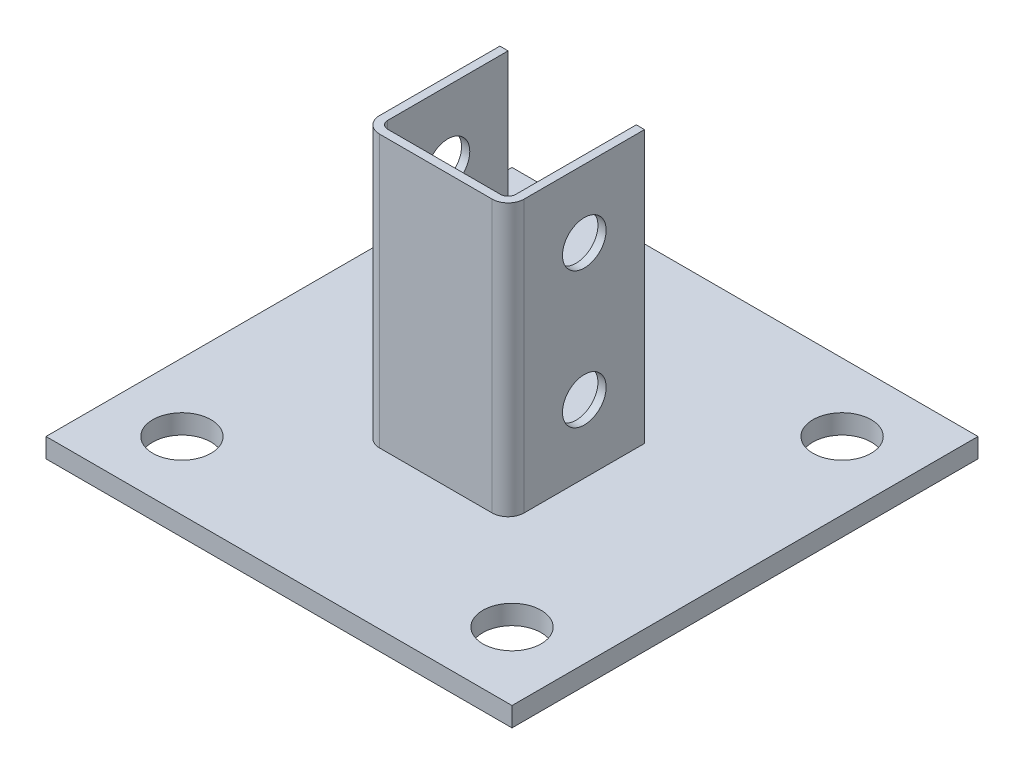
ISO-10303-21;
HEADER;
FILE_DESCRIPTION(('STEP AP214'),'2;1');
FILE_NAME('part.step','',(''),(''),'','','');
FILE_SCHEMA(('AUTOMOTIVE_DESIGN { 1 0 10303 214 1 1 1 1 }'));
ENDSEC;
DATA;
#1=APPLICATION_CONTEXT('core data for automotive mechanical design processes');
#2=APPLICATION_PROTOCOL_DEFINITION('international standard','automotive_design',2000,#1);
#3=PRODUCT_CONTEXT('',#1,'mechanical');
#4=PRODUCT('Part','Part','',(#3));
#5=PRODUCT_RELATED_PRODUCT_CATEGORY('part','',(#4));
#6=PRODUCT_DEFINITION_FORMATION('','',#4);
#7=PRODUCT_DEFINITION_CONTEXT('part definition',#1,'design');
#8=PRODUCT_DEFINITION('design','',#6,#7);
#9=PRODUCT_DEFINITION_SHAPE('','',#8);
#10=(LENGTH_UNIT() NAMED_UNIT(*) SI_UNIT(.MILLI.,.METRE.));
#11=(NAMED_UNIT(*) PLANE_ANGLE_UNIT() SI_UNIT($,.RADIAN.));
#12=(NAMED_UNIT(*) SI_UNIT($,.STERADIAN.) SOLID_ANGLE_UNIT());
#13=UNCERTAINTY_MEASURE_WITH_UNIT(LENGTH_MEASURE(1.E-05),#10,'distance_accuracy_value','');
#14=(GEOMETRIC_REPRESENTATION_CONTEXT(3) GLOBAL_UNCERTAINTY_ASSIGNED_CONTEXT((#13)) GLOBAL_UNIT_ASSIGNED_CONTEXT((#10,
#11,#12)) REPRESENTATION_CONTEXT('',''));
#15=CARTESIAN_POINT('',(0.,0.,0.));
#16=DIRECTION('',(0.,0.,1.));
#17=DIRECTION('',(1.,0.,0.));
#18=AXIS2_PLACEMENT_3D('',#15,#16,#17);
#19=CARTESIAN_POINT('',(-76.2,6.35,-76.2));
#20=DIRECTION('',(0.,1.,0.));
#21=DIRECTION('',(0.,0.,1.));
#22=AXIS2_PLACEMENT_3D('',#19,#20,#21);
#23=PLANE('',#22);
#24=DIRECTION('',(0.,0.,1.));
#25=VECTOR('',#24,1.);
#26=CARTESIAN_POINT('',(-76.2,6.35,76.2));
#27=LINE('',#26,#25);
#28=CARTESIAN_POINT('',(-76.2,6.35,-76.2));
#29=VERTEX_POINT('',#28);
#30=CARTESIAN_POINT('',(-76.2,6.35,76.2));
#31=VERTEX_POINT('',#30);
#32=EDGE_CURVE('E281',#29,#31,#27,.T.);
#33=ORIENTED_EDGE('',*,*,#32,.T.);
#34=DIRECTION('',(1.,0.,0.));
#35=VECTOR('',#34,1.);
#36=CARTESIAN_POINT('',(76.2,6.35,76.2));
#37=LINE('',#36,#35);
#38=CARTESIAN_POINT('',(76.2,6.35,76.2));
#39=VERTEX_POINT('',#38);
#40=EDGE_CURVE('E87',#31,#39,#37,.T.);
#41=ORIENTED_EDGE('',*,*,#40,.T.);
#42=DIRECTION('',(0.,0.,-1.));
#43=VECTOR('',#42,1.);
#44=CARTESIAN_POINT('',(76.2,6.35,76.2));
#45=LINE('',#44,#43);
#46=CARTESIAN_POINT('',(76.2,6.35,-76.2));
#47=VERTEX_POINT('',#46);
#48=EDGE_CURVE('E284',#39,#47,#45,.T.);
#49=ORIENTED_EDGE('',*,*,#48,.T.);
#50=DIRECTION('',(-1.,0.,0.));
#51=VECTOR('',#50,1.);
#52=CARTESIAN_POINT('',(76.2,6.35,-76.2));
#53=LINE('',#52,#51);
#54=EDGE_CURVE('E59',#47,#29,#53,.T.);
#55=ORIENTED_EDGE('',*,*,#54,.T.);
#56=EDGE_LOOP('',(#33,#41,#49,#55));
#57=FACE_BOUND('',#56,.T.);
#58=CARTESIAN_POINT('',(-53.975,6.35,53.975));
#59=DIRECTION('',(0.,1.,0.));
#60=DIRECTION('',(0.,0.,1.));
#61=AXIS2_PLACEMENT_3D('',#58,#59,#60);
#62=CIRCLE('',#61,9.52499999999998);
#63=CARTESIAN_POINT('',(-53.975,6.35,63.5));
#64=VERTEX_POINT('',#63);
#65=EDGE_CURVE('E274',#64,#64,#62,.T.);
#66=ORIENTED_EDGE('',*,*,#65,.F.);
#67=EDGE_LOOP('',(#66));
#68=FACE_BOUND('',#67,.T.);
#69=CARTESIAN_POINT('',(53.975,6.35,53.975));
#70=DIRECTION('',(0.,1.,0.));
#71=DIRECTION('',(0.,0.,1.));
#72=AXIS2_PLACEMENT_3D('',#69,#70,#71);
#73=CIRCLE('',#72,9.52499999999998);
#74=CARTESIAN_POINT('',(53.975,6.35,63.5));
#75=VERTEX_POINT('',#74);
#76=EDGE_CURVE('E270',#75,#75,#73,.T.);
#77=ORIENTED_EDGE('',*,*,#76,.F.);
#78=EDGE_LOOP('',(#77));
#79=FACE_BOUND('',#78,.T.);
#80=CARTESIAN_POINT('',(53.975,6.35,-53.9750000000001));
#81=DIRECTION('',(0.,1.,0.));
#82=DIRECTION('',(0.,0.,1.));
#83=AXIS2_PLACEMENT_3D('',#80,#81,#82);
#84=CIRCLE('',#83,9.52499999999998);
#85=CARTESIAN_POINT('',(53.975,6.35,-44.4500000000001));
#86=VERTEX_POINT('',#85);
#87=EDGE_CURVE('E264',#86,#86,#84,.T.);
#88=ORIENTED_EDGE('',*,*,#87,.F.);
#89=EDGE_LOOP('',(#88));
#90=FACE_BOUND('',#89,.T.);
#91=CARTESIAN_POINT('',(-53.975,6.35,-53.975));
#92=DIRECTION('',(0.,1.,0.));
#93=DIRECTION('',(0.,0.,1.));
#94=AXIS2_PLACEMENT_3D('',#91,#92,#93);
#95=CIRCLE('',#94,9.52499999999998);
#96=CARTESIAN_POINT('',(-53.975,6.35,-44.4500000000001));
#97=VERTEX_POINT('',#96);
#98=EDGE_CURVE('E179',#97,#97,#95,.T.);
#99=ORIENTED_EDGE('',*,*,#98,.F.);
#100=EDGE_LOOP('',(#99));
#101=FACE_BOUND('',#100,.T.);
#102=DIRECTION('',(1.,0.,0.));
#103=VECTOR('',#102,1.);
#104=CARTESIAN_POINT('',(20.955,6.35,-19.685));
#105=LINE('',#104,#103);
#106=CARTESIAN_POINT('',(20.955,6.35,-19.685));
#107=VERTEX_POINT('',#106);
#108=CARTESIAN_POINT('',(23.6474,6.35,-19.685));
#109=VERTEX_POINT('',#108);
#110=EDGE_CURVE('E212',#107,#109,#105,.T.);
#111=ORIENTED_EDGE('',*,*,#110,.T.);
#112=DIRECTION('',(0.,0.,-1.));
#113=VECTOR('',#112,1.);
#114=CARTESIAN_POINT('',(23.6474,6.35,19.685));
#115=LINE('',#114,#113);
#116=CARTESIAN_POINT('',(23.6474,6.35,19.685));
#117=VERTEX_POINT('',#116);
#118=EDGE_CURVE('E175',#117,#109,#115,.T.);
#119=ORIENTED_EDGE('',*,*,#118,.F.);
#120=CARTESIAN_POINT('',(18.415,6.35,19.685));
#121=DIRECTION('',(0.,1.,0.));
#122=DIRECTION('',(1.,0.,0.));
#123=AXIS2_PLACEMENT_3D('',#120,#121,#122);
#124=CIRCLE('',#123,5.2324);
#125=CARTESIAN_POINT('',(18.415,6.34999999999999,24.9174));
#126=VERTEX_POINT('',#125);
#127=EDGE_CURVE('E169',#126,#117,#124,.T.);
#128=ORIENTED_EDGE('',*,*,#127,.F.);
#129=DIRECTION('',(1.,0.,0.));
#130=VECTOR('',#129,1.);
#131=CARTESIAN_POINT('',(-18.415,6.35,24.9174));
#132=LINE('',#131,#130);
#133=CARTESIAN_POINT('',(-18.415,6.35,24.9174));
#134=VERTEX_POINT('',#133);
#135=EDGE_CURVE('E237',#134,#126,#132,.T.);
#136=ORIENTED_EDGE('',*,*,#135,.F.);
#137=CARTESIAN_POINT('',(-18.415,6.35,19.685));
#138=DIRECTION('',(0.,1.,0.));
#139=DIRECTION('',(1.,0.,0.));
#140=AXIS2_PLACEMENT_3D('',#137,#138,#139);
#141=CIRCLE('',#140,5.2324);
#142=CARTESIAN_POINT('',(-23.6474,6.35,19.685));
#143=VERTEX_POINT('',#142);
#144=EDGE_CURVE('E235',#143,#134,#141,.T.);
#145=ORIENTED_EDGE('',*,*,#144,.F.);
#146=DIRECTION('',(0.,0.,1.));
#147=VECTOR('',#146,1.);
#148=CARTESIAN_POINT('',(-23.6474,6.35,-19.685));
#149=LINE('',#148,#147);
#150=CARTESIAN_POINT('',(-23.6474,6.35,-19.685));
#151=VERTEX_POINT('',#150);
#152=EDGE_CURVE('E233',#151,#143,#149,.T.);
#153=ORIENTED_EDGE('',*,*,#152,.F.);
#154=DIRECTION('',(1.,0.,0.));
#155=VECTOR('',#154,1.);
#156=CARTESIAN_POINT('',(-23.6474,6.35,-19.685));
#157=LINE('',#156,#155);
#158=CARTESIAN_POINT('',(-20.955,6.35,-19.685));
#159=VERTEX_POINT('',#158);
#160=EDGE_CURVE('E230',#151,#159,#157,.T.);
#161=ORIENTED_EDGE('',*,*,#160,.T.);
#162=DIRECTION('',(0.,0.,1.));
#163=VECTOR('',#162,1.);
#164=CARTESIAN_POINT('',(-20.955,6.35,-19.685));
#165=LINE('',#164,#163);
#166=CARTESIAN_POINT('',(-20.955,6.35,19.685));
#167=VERTEX_POINT('',#166);
#168=EDGE_CURVE('E227',#159,#167,#165,.T.);
#169=ORIENTED_EDGE('',*,*,#168,.T.);
#170=CARTESIAN_POINT('',(-18.415,6.35,19.685));
#171=DIRECTION('',(0.,1.,0.));
#172=DIRECTION('',(0.,0.,1.));
#173=AXIS2_PLACEMENT_3D('',#170,#171,#172);
#174=CIRCLE('',#173,2.54);
#175=CARTESIAN_POINT('',(-18.415,6.35,22.225));
#176=VERTEX_POINT('',#175);
#177=EDGE_CURVE('E224',#167,#176,#174,.T.);
#178=ORIENTED_EDGE('',*,*,#177,.T.);
#179=DIRECTION('',(1.,0.,0.));
#180=VECTOR('',#179,1.);
#181=CARTESIAN_POINT('',(-18.415,6.35,22.225));
#182=LINE('',#181,#180);
#183=CARTESIAN_POINT('',(18.415,6.35,22.225));
#184=VERTEX_POINT('',#183);
#185=EDGE_CURVE('E221',#176,#184,#182,.T.);
#186=ORIENTED_EDGE('',*,*,#185,.T.);
#187=CARTESIAN_POINT('',(18.415,6.35,19.685));
#188=DIRECTION('',(0.,1.,0.));
#189=DIRECTION('',(0.,0.,1.));
#190=AXIS2_PLACEMENT_3D('',#187,#188,#189);
#191=CIRCLE('',#190,2.54);
#192=CARTESIAN_POINT('',(20.955,6.35,19.685));
#193=VERTEX_POINT('',#192);
#194=EDGE_CURVE('E218',#184,#193,#191,.T.);
#195=ORIENTED_EDGE('',*,*,#194,.T.);
#196=DIRECTION('',(0.,0.,-1.));
#197=VECTOR('',#196,1.);
#198=CARTESIAN_POINT('',(20.955,6.35,19.685));
#199=LINE('',#198,#197);
#200=EDGE_CURVE('E215',#193,#107,#199,.T.);
#201=ORIENTED_EDGE('',*,*,#200,.T.);
#202=EDGE_LOOP('',(#111,#119,#128,#136,#145,#153,#161,#169,#178,#186,#195,#201));
#203=FACE_BOUND('',#202,.T.);
#204=ADVANCED_FACE('F33',(#57,#68,#79,#90,#101,#203),#23,.T.);
#205=CARTESIAN_POINT('',(-76.2,6.35,76.2));
#206=DIRECTION('',(1.,0.,0.));
#207=DIRECTION('',(0.,0.,-1.));
#208=AXIS2_PLACEMENT_3D('',#205,#206,#207);
#209=PLANE('',#208);
#210=DIRECTION('',(0.,0.,1.));
#211=VECTOR('',#210,1.);
#212=CARTESIAN_POINT('',(-76.2,0.,76.2));
#213=LINE('',#212,#211);
#214=CARTESIAN_POINT('',(-76.2,0.,-76.2));
#215=VERTEX_POINT('',#214);
#216=CARTESIAN_POINT('',(-76.2,0.,76.2));
#217=VERTEX_POINT('',#216);
#218=EDGE_CURVE('E280',#215,#217,#213,.T.);
#219=ORIENTED_EDGE('',*,*,#218,.T.);
#220=DIRECTION('',(0.,-1.,0.));
#221=VECTOR('',#220,1.);
#222=CARTESIAN_POINT('',(-76.2,6.35,76.2));
#223=LINE('',#222,#221);
#224=EDGE_CURVE('E11',#31,#217,#223,.T.);
#225=ORIENTED_EDGE('',*,*,#224,.F.);
#226=ORIENTED_EDGE('',*,*,#32,.F.);
#227=DIRECTION('',(0.,-1.,0.));
#228=VECTOR('',#227,1.);
#229=CARTESIAN_POINT('',(-76.2,6.35,-76.2));
#230=LINE('',#229,#228);
#231=EDGE_CURVE('E287',#29,#215,#230,.T.);
#232=ORIENTED_EDGE('',*,*,#231,.T.);
#233=EDGE_LOOP('',(#219,#225,#226,#232));
#234=FACE_BOUND('',#233,.T.);
#235=ADVANCED_FACE('F35',(#234),#209,.F.);
#236=CARTESIAN_POINT('',(76.2,6.35,76.2));
#237=DIRECTION('',(0.,0.,-1.));
#238=DIRECTION('',(-1.,0.,0.));
#239=AXIS2_PLACEMENT_3D('',#236,#237,#238);
#240=PLANE('',#239);
#241=DIRECTION('',(1.,0.,0.));
#242=VECTOR('',#241,1.);
#243=CARTESIAN_POINT('',(76.2,0.,76.2));
#244=LINE('',#243,#242);
#245=CARTESIAN_POINT('',(76.2,0.,76.2));
#246=VERTEX_POINT('',#245);
#247=EDGE_CURVE('E290',#217,#246,#244,.T.);
#248=ORIENTED_EDGE('',*,*,#247,.T.);
#249=DIRECTION('',(0.,-1.,0.));
#250=VECTOR('',#249,1.);
#251=CARTESIAN_POINT('',(76.2,6.35,76.2));
#252=LINE('',#251,#250);
#253=EDGE_CURVE('E42',#39,#246,#252,.T.);
#254=ORIENTED_EDGE('',*,*,#253,.F.);
#255=ORIENTED_EDGE('',*,*,#40,.F.);
#256=ORIENTED_EDGE('',*,*,#224,.T.);
#257=EDGE_LOOP('',(#248,#254,#255,#256));
#258=FACE_BOUND('',#257,.T.);
#259=ADVANCED_FACE('F344',(#258),#240,.F.);
#260=CARTESIAN_POINT('',(76.2,6.35,76.2));
#261=DIRECTION('',(-1.,0.,0.));
#262=DIRECTION('',(0.,0.,1.));
#263=AXIS2_PLACEMENT_3D('',#260,#261,#262);
#264=PLANE('',#263);
#265=DIRECTION('',(0.,0.,-1.));
#266=VECTOR('',#265,1.);
#267=CARTESIAN_POINT('',(76.2,0.,76.2));
#268=LINE('',#267,#266);
#269=CARTESIAN_POINT('',(76.2,0.,-76.2));
#270=VERTEX_POINT('',#269);
#271=EDGE_CURVE('E292',#246,#270,#268,.T.);
#272=ORIENTED_EDGE('',*,*,#271,.T.);
#273=DIRECTION('',(0.,-1.,0.));
#274=VECTOR('',#273,1.);
#275=CARTESIAN_POINT('',(76.2,6.35,-76.2));
#276=LINE('',#275,#274);
#277=EDGE_CURVE('E296',#47,#270,#276,.T.);
#278=ORIENTED_EDGE('',*,*,#277,.F.);
#279=ORIENTED_EDGE('',*,*,#48,.F.);
#280=ORIENTED_EDGE('',*,*,#253,.T.);
#281=EDGE_LOOP('',(#272,#278,#279,#280));
#282=FACE_BOUND('',#281,.T.);
#283=ADVANCED_FACE('F358',(#282),#264,.F.);
#284=CARTESIAN_POINT('',(76.2,6.35,-76.2));
#285=DIRECTION('',(0.,0.,1.));
#286=DIRECTION('',(1.,0.,0.));
#287=AXIS2_PLACEMENT_3D('',#284,#285,#286);
#288=PLANE('',#287);
#289=DIRECTION('',(-1.,0.,0.));
#290=VECTOR('',#289,1.);
#291=CARTESIAN_POINT('',(76.2,0.,-76.2));
#292=LINE('',#291,#290);
#293=EDGE_CURVE('E80',#270,#215,#292,.T.);
#294=ORIENTED_EDGE('',*,*,#293,.T.);
#295=ORIENTED_EDGE('',*,*,#231,.F.);
#296=ORIENTED_EDGE('',*,*,#54,.F.);
#297=ORIENTED_EDGE('',*,*,#277,.T.);
#298=EDGE_LOOP('',(#294,#295,#296,#297));
#299=FACE_BOUND('',#298,.T.);
#300=ADVANCED_FACE('F354',(#299),#288,.F.);
#301=CARTESIAN_POINT('',(-76.2,0.,-76.2));
#302=DIRECTION('',(0.,1.,0.));
#303=DIRECTION('',(0.,0.,1.));
#304=AXIS2_PLACEMENT_3D('',#301,#302,#303);
#305=PLANE('',#304);
#306=CARTESIAN_POINT('',(-53.975,0.,-53.975));
#307=DIRECTION('',(0.,1.,0.));
#308=DIRECTION('',(0.,0.,1.));
#309=AXIS2_PLACEMENT_3D('',#306,#307,#308);
#310=CIRCLE('',#309,9.52499999999998);
#311=CARTESIAN_POINT('',(-53.975,0.,-44.4500000000001));
#312=VERTEX_POINT('',#311);
#313=EDGE_CURVE('E263',#312,#312,#310,.T.);
#314=ORIENTED_EDGE('',*,*,#313,.T.);
#315=EDGE_LOOP('',(#314));
#316=FACE_BOUND('',#315,.T.);
#317=CARTESIAN_POINT('',(53.975,0.,-53.9750000000001));
#318=DIRECTION('',(0.,1.,0.));
#319=DIRECTION('',(0.,0.,1.));
#320=AXIS2_PLACEMENT_3D('',#317,#318,#319);
#321=CIRCLE('',#320,9.52499999999998);
#322=CARTESIAN_POINT('',(53.975,0.,-44.4500000000001));
#323=VERTEX_POINT('',#322);
#324=EDGE_CURVE('E267',#323,#323,#321,.T.);
#325=ORIENTED_EDGE('',*,*,#324,.T.);
#326=EDGE_LOOP('',(#325));
#327=FACE_BOUND('',#326,.T.);
#328=CARTESIAN_POINT('',(53.975,0.,53.975));
#329=DIRECTION('',(0.,1.,0.));
#330=DIRECTION('',(0.,0.,1.));
#331=AXIS2_PLACEMENT_3D('',#328,#329,#330);
#332=CIRCLE('',#331,9.52499999999998);
#333=CARTESIAN_POINT('',(53.975,0.,63.5));
#334=VERTEX_POINT('',#333);
#335=EDGE_CURVE('E273',#334,#334,#332,.T.);
#336=ORIENTED_EDGE('',*,*,#335,.T.);
#337=EDGE_LOOP('',(#336));
#338=FACE_BOUND('',#337,.T.);
#339=CARTESIAN_POINT('',(-53.975,0.,53.975));
#340=DIRECTION('',(0.,1.,0.));
#341=DIRECTION('',(0.,0.,1.));
#342=AXIS2_PLACEMENT_3D('',#339,#340,#341);
#343=CIRCLE('',#342,9.52499999999998);
#344=CARTESIAN_POINT('',(-53.975,0.,63.5));
#345=VERTEX_POINT('',#344);
#346=EDGE_CURVE('E277',#345,#345,#343,.T.);
#347=ORIENTED_EDGE('',*,*,#346,.T.);
#348=EDGE_LOOP('',(#347));
#349=FACE_BOUND('',#348,.T.);
#350=ORIENTED_EDGE('',*,*,#218,.F.);
#351=ORIENTED_EDGE('',*,*,#293,.F.);
#352=ORIENTED_EDGE('',*,*,#271,.F.);
#353=ORIENTED_EDGE('',*,*,#247,.F.);
#354=EDGE_LOOP('',(#350,#351,#352,#353));
#355=FACE_BOUND('',#354,.T.);
#356=ADVANCED_FACE('F351',(#316,#327,#338,#349,#355),#305,.F.);
#357=CARTESIAN_POINT('',(-53.975,6.35,53.975));
#358=DIRECTION('',(0.,1.,0.));
#359=DIRECTION('',(0.,0.,1.));
#360=AXIS2_PLACEMENT_3D('',#357,#358,#359);
#361=CYLINDRICAL_SURFACE('',#360,9.52499999999998);
#362=ORIENTED_EDGE('',*,*,#65,.T.);
#363=EDGE_LOOP('',(#362));
#364=FACE_BOUND('',#363,.T.);
#365=ORIENTED_EDGE('',*,*,#346,.F.);
#366=EDGE_LOOP('',(#365));
#367=FACE_BOUND('',#366,.T.);
#368=ADVANCED_FACE('F349',(#364,#367),#361,.F.);
#369=CARTESIAN_POINT('',(53.975,6.35,53.975));
#370=DIRECTION('',(0.,1.,0.));
#371=DIRECTION('',(0.,0.,1.));
#372=AXIS2_PLACEMENT_3D('',#369,#370,#371);
#373=CYLINDRICAL_SURFACE('',#372,9.52499999999998);
#374=ORIENTED_EDGE('',*,*,#76,.T.);
#375=EDGE_LOOP('',(#374));
#376=FACE_BOUND('',#375,.T.);
#377=ORIENTED_EDGE('',*,*,#335,.F.);
#378=EDGE_LOOP('',(#377));
#379=FACE_BOUND('',#378,.T.);
#380=ADVANCED_FACE('F391',(#376,#379),#373,.F.);
#381=CARTESIAN_POINT('',(53.975,6.35,-53.9750000000001));
#382=DIRECTION('',(0.,1.,0.));
#383=DIRECTION('',(0.,0.,1.));
#384=AXIS2_PLACEMENT_3D('',#381,#382,#383);
#385=CYLINDRICAL_SURFACE('',#384,9.52499999999998);
#386=ORIENTED_EDGE('',*,*,#87,.T.);
#387=EDGE_LOOP('',(#386));
#388=FACE_BOUND('',#387,.T.);
#389=ORIENTED_EDGE('',*,*,#324,.F.);
#390=EDGE_LOOP('',(#389));
#391=FACE_BOUND('',#390,.T.);
#392=ADVANCED_FACE('F398',(#388,#391),#385,.F.);
#393=CARTESIAN_POINT('',(-53.975,6.35,-53.975));
#394=DIRECTION('',(0.,1.,0.));
#395=DIRECTION('',(0.,0.,1.));
#396=AXIS2_PLACEMENT_3D('',#393,#394,#395);
#397=CYLINDRICAL_SURFACE('',#396,9.52499999999998);
#398=ORIENTED_EDGE('',*,*,#98,.T.);
#399=EDGE_LOOP('',(#398));
#400=FACE_BOUND('',#399,.T.);
#401=ORIENTED_EDGE('',*,*,#313,.F.);
#402=EDGE_LOOP('',(#401));
#403=FACE_BOUND('',#402,.T.);
#404=ADVANCED_FACE('F405',(#400,#403),#397,.F.);
#405=CARTESIAN_POINT('',(23.6474,95.25,19.685));
#406=DIRECTION('',(-1.,0.,0.));
#407=DIRECTION('',(0.,0.,1.));
#408=AXIS2_PLACEMENT_3D('',#405,#406,#407);
#409=PLANE('',#408);
#410=CARTESIAN_POINT('',(23.6474,73.025,0.));
#411=DIRECTION('',(1.,0.,0.));
#412=DIRECTION('',(0.,0.,-1.));
#413=AXIS2_PLACEMENT_3D('',#410,#411,#412);
#414=CIRCLE('',#413,7.14374999999999);
#415=CARTESIAN_POINT('',(23.6474,73.025,-7.14374999999999));
#416=VERTEX_POINT('',#415);
#417=EDGE_CURVE('E546',#416,#416,#414,.T.);
#418=ORIENTED_EDGE('',*,*,#417,.F.);
#419=EDGE_LOOP('',(#418));
#420=FACE_BOUND('',#419,.T.);
#421=CARTESIAN_POINT('',(23.6474,28.575,0.));
#422=DIRECTION('',(1.,0.,0.));
#423=DIRECTION('',(0.,0.,-1.));
#424=AXIS2_PLACEMENT_3D('',#421,#422,#423);
#425=CIRCLE('',#424,7.14374999999999);
#426=CARTESIAN_POINT('',(23.6474,28.575,-7.14374999999999));
#427=VERTEX_POINT('',#426);
#428=EDGE_CURVE('E306',#427,#427,#425,.T.);
#429=ORIENTED_EDGE('',*,*,#428,.F.);
#430=EDGE_LOOP('',(#429));
#431=FACE_BOUND('',#430,.T.);
#432=ORIENTED_EDGE('',*,*,#118,.T.);
#433=DIRECTION('',(0.,-1.,0.));
#434=VECTOR('',#433,1.);
#435=CARTESIAN_POINT('',(23.6474,95.25,-19.685));
#436=LINE('',#435,#434);
#437=CARTESIAN_POINT('',(23.6474,95.25,-19.685));
#438=VERTEX_POINT('',#437);
#439=EDGE_CURVE('E172',#438,#109,#436,.T.);
#440=ORIENTED_EDGE('',*,*,#439,.F.);
#441=DIRECTION('',(0.,0.,-1.));
#442=VECTOR('',#441,1.);
#443=CARTESIAN_POINT('',(23.6474,95.25,19.685));
#444=LINE('',#443,#442);
#445=CARTESIAN_POINT('',(23.6474,95.25,19.685));
#446=VERTEX_POINT('',#445);
#447=EDGE_CURVE('E158',#446,#438,#444,.T.);
#448=ORIENTED_EDGE('',*,*,#447,.F.);
#449=DIRECTION('',(0.,-1.,0.));
#450=VECTOR('',#449,1.);
#451=CARTESIAN_POINT('',(23.6474,95.25,19.685));
#452=LINE('',#451,#450);
#453=EDGE_CURVE('E210',#446,#117,#452,.T.);
#454=ORIENTED_EDGE('',*,*,#453,.T.);
#455=EDGE_LOOP('',(#432,#440,#448,#454));
#456=FACE_BOUND('',#455,.T.);
#457=ADVANCED_FACE('F173',(#420,#431,#456),#409,.F.);
#458=CARTESIAN_POINT('',(20.955,95.25,-19.685));
#459=DIRECTION('',(0.,0.,-1.));
#460=DIRECTION('',(-1.,0.,0.));
#461=AXIS2_PLACEMENT_3D('',#458,#459,#460);
#462=PLANE('',#461);
#463=ORIENTED_EDGE('',*,*,#110,.F.);
#464=DIRECTION('',(0.,-1.,0.));
#465=VECTOR('',#464,1.);
#466=CARTESIAN_POINT('',(20.955,95.25,-19.685));
#467=LINE('',#466,#465);
#468=CARTESIAN_POINT('',(20.955,95.25,-19.685));
#469=VERTEX_POINT('',#468);
#470=EDGE_CURVE('E180',#469,#107,#467,.T.);
#471=ORIENTED_EDGE('',*,*,#470,.F.);
#472=DIRECTION('',(1.,0.,0.));
#473=VECTOR('',#472,1.);
#474=CARTESIAN_POINT('',(20.955,95.25,-19.685));
#475=LINE('',#474,#473);
#476=EDGE_CURVE('E163',#469,#438,#475,.T.);
#477=ORIENTED_EDGE('',*,*,#476,.T.);
#478=ORIENTED_EDGE('',*,*,#439,.T.);
#479=EDGE_LOOP('',(#463,#471,#477,#478));
#480=FACE_BOUND('',#479,.T.);
#481=ADVANCED_FACE('F182',(#480),#462,.T.);
#482=CARTESIAN_POINT('',(20.955,95.25,19.685));
#483=DIRECTION('',(-1.,0.,0.));
#484=DIRECTION('',(0.,0.,1.));
#485=AXIS2_PLACEMENT_3D('',#482,#483,#484);
#486=PLANE('',#485);
#487=CARTESIAN_POINT('',(20.955,73.025,0.));
#488=DIRECTION('',(-1.,0.,0.));
#489=DIRECTION('',(0.,0.,1.));
#490=AXIS2_PLACEMENT_3D('',#487,#488,#489);
#491=CIRCLE('',#490,7.14374999999998);
#492=CARTESIAN_POINT('',(20.955,73.025,7.14374999999999));
#493=VERTEX_POINT('',#492);
#494=EDGE_CURVE('E317',#493,#493,#491,.T.);
#495=ORIENTED_EDGE('',*,*,#494,.F.);
#496=EDGE_LOOP('',(#495));
#497=FACE_BOUND('',#496,.T.);
#498=CARTESIAN_POINT('',(20.955,28.575,0.));
#499=DIRECTION('',(-1.,0.,0.));
#500=DIRECTION('',(0.,0.,1.));
#501=AXIS2_PLACEMENT_3D('',#498,#499,#500);
#502=CIRCLE('',#501,7.14374999999998);
#503=CARTESIAN_POINT('',(20.955,28.575,7.14374999999999));
#504=VERTEX_POINT('',#503);
#505=EDGE_CURVE('E305',#504,#504,#502,.T.);
#506=ORIENTED_EDGE('',*,*,#505,.F.);
#507=EDGE_LOOP('',(#506));
#508=FACE_BOUND('',#507,.T.);
#509=ORIENTED_EDGE('',*,*,#200,.F.);
#510=DIRECTION('',(0.,-1.,0.));
#511=VECTOR('',#510,1.);
#512=CARTESIAN_POINT('',(20.955,95.25,19.685));
#513=LINE('',#512,#511);
#514=CARTESIAN_POINT('',(20.955,95.25,19.685));
#515=VERTEX_POINT('',#514);
#516=EDGE_CURVE('E258',#515,#193,#513,.T.);
#517=ORIENTED_EDGE('',*,*,#516,.F.);
#518=DIRECTION('',(0.,0.,-1.));
#519=VECTOR('',#518,1.);
#520=CARTESIAN_POINT('',(20.955,95.25,19.685));
#521=LINE('',#520,#519);
#522=EDGE_CURVE('E183',#515,#469,#521,.T.);
#523=ORIENTED_EDGE('',*,*,#522,.T.);
#524=ORIENTED_EDGE('',*,*,#470,.T.);
#525=EDGE_LOOP('',(#509,#517,#523,#524));
#526=FACE_BOUND('',#525,.T.);
#527=ADVANCED_FACE('F429',(#497,#508,#526),#486,.T.);
#528=CARTESIAN_POINT('',(18.415,95.25,19.685));
#529=DIRECTION('',(0.,-1.,0.));
#530=DIRECTION('',(0.,0.,-1.));
#531=AXIS2_PLACEMENT_3D('',#528,#529,#530);
#532=CYLINDRICAL_SURFACE('',#531,2.54);
#533=ORIENTED_EDGE('',*,*,#194,.F.);
#534=DIRECTION('',(0.,-1.,0.));
#535=VECTOR('',#534,1.);
#536=CARTESIAN_POINT('',(18.415,95.25,22.225));
#537=LINE('',#536,#535);
#538=CARTESIAN_POINT('',(18.415,95.25,22.225));
#539=VERTEX_POINT('',#538);
#540=EDGE_CURVE('E256',#539,#184,#537,.T.);
#541=ORIENTED_EDGE('',*,*,#540,.F.);
#542=CARTESIAN_POINT('',(18.415,95.25,19.685));
#543=DIRECTION('',(0.,1.,0.));
#544=DIRECTION('',(0.,0.,1.));
#545=AXIS2_PLACEMENT_3D('',#542,#543,#544);
#546=CIRCLE('',#545,2.54);
#547=EDGE_CURVE('E185',#539,#515,#546,.T.);
#548=ORIENTED_EDGE('',*,*,#547,.T.);
#549=ORIENTED_EDGE('',*,*,#516,.T.);
#550=EDGE_LOOP('',(#533,#541,#548,#549));
#551=FACE_BOUND('',#550,.T.);
#552=ADVANCED_FACE('F436',(#551),#532,.F.);
#553=CARTESIAN_POINT('',(-18.415,95.25,22.225));
#554=DIRECTION('',(0.,0.,-1.));
#555=DIRECTION('',(-1.,0.,0.));
#556=AXIS2_PLACEMENT_3D('',#553,#554,#555);
#557=PLANE('',#556);
#558=ORIENTED_EDGE('',*,*,#185,.F.);
#559=DIRECTION('',(0.,-1.,0.));
#560=VECTOR('',#559,1.);
#561=CARTESIAN_POINT('',(-18.415,95.25,22.225));
#562=LINE('',#561,#560);
#563=CARTESIAN_POINT('',(-18.415,95.25,22.225));
#564=VERTEX_POINT('',#563);
#565=EDGE_CURVE('E254',#564,#176,#562,.T.);
#566=ORIENTED_EDGE('',*,*,#565,.F.);
#567=DIRECTION('',(1.,0.,0.));
#568=VECTOR('',#567,1.);
#569=CARTESIAN_POINT('',(-18.415,95.25,22.225));
#570=LINE('',#569,#568);
#571=EDGE_CURVE('E191',#564,#539,#570,.T.);
#572=ORIENTED_EDGE('',*,*,#571,.T.);
#573=ORIENTED_EDGE('',*,*,#540,.T.);
#574=EDGE_LOOP('',(#558,#566,#572,#573));
#575=FACE_BOUND('',#574,.T.);
#576=ADVANCED_FACE('F444',(#575),#557,.T.);
#577=CARTESIAN_POINT('',(-18.415,95.25,19.685));
#578=DIRECTION('',(0.,-1.,0.));
#579=DIRECTION('',(0.,0.,-1.));
#580=AXIS2_PLACEMENT_3D('',#577,#578,#579);
#581=CYLINDRICAL_SURFACE('',#580,2.54);
#582=ORIENTED_EDGE('',*,*,#177,.F.);
#583=DIRECTION('',(0.,-1.,0.));
#584=VECTOR('',#583,1.);
#585=CARTESIAN_POINT('',(-20.955,95.25,19.685));
#586=LINE('',#585,#584);
#587=CARTESIAN_POINT('',(-20.955,95.25,19.685));
#588=VERTEX_POINT('',#587);
#589=EDGE_CURVE('E252',#588,#167,#586,.T.);
#590=ORIENTED_EDGE('',*,*,#589,.F.);
#591=CARTESIAN_POINT('',(-18.415,95.25,19.685));
#592=DIRECTION('',(0.,1.,0.));
#593=DIRECTION('',(0.,0.,1.));
#594=AXIS2_PLACEMENT_3D('',#591,#592,#593);
#595=CIRCLE('',#594,2.54);
#596=EDGE_CURVE('E194',#588,#564,#595,.T.);
#597=ORIENTED_EDGE('',*,*,#596,.T.);
#598=ORIENTED_EDGE('',*,*,#565,.T.);
#599=EDGE_LOOP('',(#582,#590,#597,#598));
#600=FACE_BOUND('',#599,.T.);
#601=ADVANCED_FACE('F452',(#600),#581,.F.);
#602=CARTESIAN_POINT('',(-20.955,95.25,-19.685));
#603=DIRECTION('',(1.,0.,0.));
#604=DIRECTION('',(0.,0.,-1.));
#605=AXIS2_PLACEMENT_3D('',#602,#603,#604);
#606=PLANE('',#605);
#607=CARTESIAN_POINT('',(-20.955,73.025,0.));
#608=DIRECTION('',(1.,0.,0.));
#609=DIRECTION('',(0.,0.,-1.));
#610=AXIS2_PLACEMENT_3D('',#607,#608,#609);
#611=CIRCLE('',#610,7.14374999999998);
#612=CARTESIAN_POINT('',(-20.955,73.025,-7.14374999999999));
#613=VERTEX_POINT('',#612);
#614=EDGE_CURVE('E312',#613,#613,#611,.T.);
#615=ORIENTED_EDGE('',*,*,#614,.F.);
#616=EDGE_LOOP('',(#615));
#617=FACE_BOUND('',#616,.T.);
#618=CARTESIAN_POINT('',(-20.955,28.575,0.));
#619=DIRECTION('',(1.,0.,0.));
#620=DIRECTION('',(0.,0.,-1.));
#621=AXIS2_PLACEMENT_3D('',#618,#619,#620);
#622=CIRCLE('',#621,7.14374999999998);
#623=CARTESIAN_POINT('',(-20.955,28.575,-7.14374999999999));
#624=VERTEX_POINT('',#623);
#625=EDGE_CURVE('E303',#624,#624,#622,.T.);
#626=ORIENTED_EDGE('',*,*,#625,.F.);
#627=EDGE_LOOP('',(#626));
#628=FACE_BOUND('',#627,.T.);
#629=ORIENTED_EDGE('',*,*,#168,.F.);
#630=DIRECTION('',(0.,-1.,0.));
#631=VECTOR('',#630,1.);
#632=CARTESIAN_POINT('',(-20.955,95.25,-19.685));
#633=LINE('',#632,#631);
#634=CARTESIAN_POINT('',(-20.955,95.25,-19.685));
#635=VERTEX_POINT('',#634);
#636=EDGE_CURVE('E250',#635,#159,#633,.T.);
#637=ORIENTED_EDGE('',*,*,#636,.F.);
#638=DIRECTION('',(0.,0.,1.));
#639=VECTOR('',#638,1.);
#640=CARTESIAN_POINT('',(-20.955,95.25,-19.685));
#641=LINE('',#640,#639);
#642=EDGE_CURVE('E197',#635,#588,#641,.T.);
#643=ORIENTED_EDGE('',*,*,#642,.T.);
#644=ORIENTED_EDGE('',*,*,#589,.T.);
#645=EDGE_LOOP('',(#629,#637,#643,#644));
#646=FACE_BOUND('',#645,.T.);
#647=ADVANCED_FACE('F460',(#617,#628,#646),#606,.T.);
#648=CARTESIAN_POINT('',(-23.6474,95.25,-19.685));
#649=DIRECTION('',(0.,0.,-1.));
#650=DIRECTION('',(-1.,0.,0.));
#651=AXIS2_PLACEMENT_3D('',#648,#649,#650);
#652=PLANE('',#651);
#653=ORIENTED_EDGE('',*,*,#160,.F.);
#654=DIRECTION('',(0.,-1.,0.));
#655=VECTOR('',#654,1.);
#656=CARTESIAN_POINT('',(-23.6474,95.25,-19.685));
#657=LINE('',#656,#655);
#658=CARTESIAN_POINT('',(-23.6474,95.25,-19.685));
#659=VERTEX_POINT('',#658);
#660=EDGE_CURVE('E248',#659,#151,#657,.T.);
#661=ORIENTED_EDGE('',*,*,#660,.F.);
#662=DIRECTION('',(1.,0.,0.));
#663=VECTOR('',#662,1.);
#664=CARTESIAN_POINT('',(-23.6474,95.25,-19.685));
#665=LINE('',#664,#663);
#666=EDGE_CURVE('E200',#659,#635,#665,.T.);
#667=ORIENTED_EDGE('',*,*,#666,.T.);
#668=ORIENTED_EDGE('',*,*,#636,.T.);
#669=EDGE_LOOP('',(#653,#661,#667,#668));
#670=FACE_BOUND('',#669,.T.);
#671=ADVANCED_FACE('F468',(#670),#652,.T.);
#672=CARTESIAN_POINT('',(-23.6474,95.25,-19.685));
#673=DIRECTION('',(1.,0.,0.));
#674=DIRECTION('',(0.,0.,-1.));
#675=AXIS2_PLACEMENT_3D('',#672,#673,#674);
#676=PLANE('',#675);
#677=CARTESIAN_POINT('',(-23.6474,73.025,0.));
#678=DIRECTION('',(1.,0.,0.));
#679=DIRECTION('',(0.,0.,-1.));
#680=AXIS2_PLACEMENT_3D('',#677,#678,#679);
#681=CIRCLE('',#680,7.14374999999998);
#682=CARTESIAN_POINT('',(-23.6474,73.025,-7.14374999999999));
#683=VERTEX_POINT('',#682);
#684=EDGE_CURVE('E37',#683,#683,#681,.T.);
#685=ORIENTED_EDGE('',*,*,#684,.T.);
#686=EDGE_LOOP('',(#685));
#687=FACE_BOUND('',#686,.T.);
#688=CARTESIAN_POINT('',(-23.6474,28.575,0.));
#689=DIRECTION('',(1.,0.,0.));
#690=DIRECTION('',(0.,0.,-1.));
#691=AXIS2_PLACEMENT_3D('',#688,#689,#690);
#692=CIRCLE('',#691,7.14374999999998);
#693=CARTESIAN_POINT('',(-23.6474,28.575,-7.14374999999999));
#694=VERTEX_POINT('',#693);
#695=EDGE_CURVE('E213',#694,#694,#692,.T.);
#696=ORIENTED_EDGE('',*,*,#695,.T.);
#697=EDGE_LOOP('',(#696));
#698=FACE_BOUND('',#697,.T.);
#699=ORIENTED_EDGE('',*,*,#152,.T.);
#700=DIRECTION('',(0.,-1.,0.));
#701=VECTOR('',#700,1.);
#702=CARTESIAN_POINT('',(-23.6474,95.25,19.685));
#703=LINE('',#702,#701);
#704=CARTESIAN_POINT('',(-23.6474,95.25,19.685));
#705=VERTEX_POINT('',#704);
#706=EDGE_CURVE('E245',#705,#143,#703,.T.);
#707=ORIENTED_EDGE('',*,*,#706,.F.);
#708=DIRECTION('',(0.,0.,1.));
#709=VECTOR('',#708,1.);
#710=CARTESIAN_POINT('',(-23.6474,95.25,-19.685));
#711=LINE('',#710,#709);
#712=EDGE_CURVE('E203',#659,#705,#711,.T.);
#713=ORIENTED_EDGE('',*,*,#712,.F.);
#714=ORIENTED_EDGE('',*,*,#660,.T.);
#715=EDGE_LOOP('',(#699,#707,#713,#714));
#716=FACE_BOUND('',#715,.T.);
#717=ADVANCED_FACE('F323',(#687,#698,#716),#676,.F.);
#718=CARTESIAN_POINT('',(-18.415,95.25,19.685));
#719=DIRECTION('',(0.,-1.,0.));
#720=DIRECTION('',(0.,0.,-1.));
#721=AXIS2_PLACEMENT_3D('',#718,#719,#720);
#722=CYLINDRICAL_SURFACE('',#721,5.2324);
#723=ORIENTED_EDGE('',*,*,#144,.T.);
#724=DIRECTION('',(0.,-1.,0.));
#725=VECTOR('',#724,1.);
#726=CARTESIAN_POINT('',(-18.415,95.25,24.9174));
#727=LINE('',#726,#725);
#728=CARTESIAN_POINT('',(-18.415,95.25,24.9174));
#729=VERTEX_POINT('',#728);
#730=EDGE_CURVE('E242',#729,#134,#727,.T.);
#731=ORIENTED_EDGE('',*,*,#730,.F.);
#732=CARTESIAN_POINT('',(-18.415,95.25,19.685));
#733=DIRECTION('',(0.,1.,0.));
#734=DIRECTION('',(1.,0.,0.));
#735=AXIS2_PLACEMENT_3D('',#732,#733,#734);
#736=CIRCLE('',#735,5.2324);
#737=EDGE_CURVE('E205',#705,#729,#736,.T.);
#738=ORIENTED_EDGE('',*,*,#737,.F.);
#739=ORIENTED_EDGE('',*,*,#706,.T.);
#740=EDGE_LOOP('',(#723,#731,#738,#739));
#741=FACE_BOUND('',#740,.T.);
#742=ADVANCED_FACE('F483',(#741),#722,.T.);
#743=CARTESIAN_POINT('',(-18.415,95.25,24.9174));
#744=DIRECTION('',(0.,0.,-1.));
#745=DIRECTION('',(-1.,0.,0.));
#746=AXIS2_PLACEMENT_3D('',#743,#744,#745);
#747=PLANE('',#746);
#748=ORIENTED_EDGE('',*,*,#135,.T.);
#749=DIRECTION('',(0.,-1.,0.));
#750=VECTOR('',#749,1.);
#751=CARTESIAN_POINT('',(18.415,95.25,24.9174));
#752=LINE('',#751,#750);
#753=CARTESIAN_POINT('',(18.415,95.25,24.9174));
#754=VERTEX_POINT('',#753);
#755=EDGE_CURVE('E50',#754,#126,#752,.T.);
#756=ORIENTED_EDGE('',*,*,#755,.F.);
#757=DIRECTION('',(1.,0.,0.));
#758=VECTOR('',#757,1.);
#759=CARTESIAN_POINT('',(-18.415,95.25,24.9174));
#760=LINE('',#759,#758);
#761=EDGE_CURVE('E207',#729,#754,#760,.T.);
#762=ORIENTED_EDGE('',*,*,#761,.F.);
#763=ORIENTED_EDGE('',*,*,#730,.T.);
#764=EDGE_LOOP('',(#748,#756,#762,#763));
#765=FACE_BOUND('',#764,.T.);
#766=ADVANCED_FACE('F490',(#765),#747,.F.);
#767=CARTESIAN_POINT('',(18.415,95.25,19.685));
#768=DIRECTION('',(0.,-1.,0.));
#769=DIRECTION('',(0.,0.,-1.));
#770=AXIS2_PLACEMENT_3D('',#767,#768,#769);
#771=CYLINDRICAL_SURFACE('',#770,5.2324);
#772=ORIENTED_EDGE('',*,*,#127,.T.);
#773=ORIENTED_EDGE('',*,*,#453,.F.);
#774=CARTESIAN_POINT('',(18.415,95.25,19.685));
#775=DIRECTION('',(0.,1.,0.));
#776=DIRECTION('',(1.,0.,0.));
#777=AXIS2_PLACEMENT_3D('',#774,#775,#776);
#778=CIRCLE('',#777,5.2324);
#779=EDGE_CURVE('E165',#754,#446,#778,.T.);
#780=ORIENTED_EDGE('',*,*,#779,.F.);
#781=ORIENTED_EDGE('',*,*,#755,.T.);
#782=EDGE_LOOP('',(#772,#773,#780,#781));
#783=FACE_BOUND('',#782,.T.);
#784=ADVANCED_FACE('F336',(#783),#771,.T.);
#785=CARTESIAN_POINT('',(18.415,95.25,19.685));
#786=DIRECTION('',(0.,1.,0.));
#787=DIRECTION('',(0.,0.,1.));
#788=AXIS2_PLACEMENT_3D('',#785,#786,#787);
#789=PLANE('',#788);
#790=ORIENTED_EDGE('',*,*,#447,.T.);
#791=ORIENTED_EDGE('',*,*,#476,.F.);
#792=ORIENTED_EDGE('',*,*,#522,.F.);
#793=ORIENTED_EDGE('',*,*,#547,.F.);
#794=ORIENTED_EDGE('',*,*,#571,.F.);
#795=ORIENTED_EDGE('',*,*,#596,.F.);
#796=ORIENTED_EDGE('',*,*,#642,.F.);
#797=ORIENTED_EDGE('',*,*,#666,.F.);
#798=ORIENTED_EDGE('',*,*,#712,.T.);
#799=ORIENTED_EDGE('',*,*,#737,.T.);
#800=ORIENTED_EDGE('',*,*,#761,.T.);
#801=ORIENTED_EDGE('',*,*,#779,.T.);
#802=EDGE_LOOP('',(#790,#791,#792,#793,#794,#795,#796,#797,#798,#799,#800,#801));
#803=FACE_BOUND('',#802,.T.);
#804=ADVANCED_FACE('F160',(#803),#789,.T.);
#805=CARTESIAN_POINT('',(23.6474,28.575,0.));
#806=DIRECTION('',(1.,0.,0.));
#807=DIRECTION('',(0.,0.,-1.));
#808=AXIS2_PLACEMENT_3D('',#805,#806,#807);
#809=CYLINDRICAL_SURFACE('',#808,7.14374999999998);
#810=ORIENTED_EDGE('',*,*,#625,.T.);
#811=EDGE_LOOP('',(#810));
#812=FACE_BOUND('',#811,.T.);
#813=ORIENTED_EDGE('',*,*,#695,.F.);
#814=EDGE_LOOP('',(#813));
#815=FACE_BOUND('',#814,.T.);
#816=ADVANCED_FACE('F326',(#812,#815),#809,.F.);
#817=ORIENTED_EDGE('',*,*,#505,.T.);
#818=EDGE_LOOP('',(#817));
#819=FACE_BOUND('',#818,.T.);
#820=ORIENTED_EDGE('',*,*,#428,.T.);
#821=EDGE_LOOP('',(#820));
#822=FACE_BOUND('',#821,.T.);
#823=ADVANCED_FACE('F328',(#819,#822),#809,.F.);
#824=CARTESIAN_POINT('',(23.6474,73.025,0.));
#825=DIRECTION('',(1.,0.,0.));
#826=DIRECTION('',(0.,0.,-1.));
#827=AXIS2_PLACEMENT_3D('',#824,#825,#826);
#828=CYLINDRICAL_SURFACE('',#827,7.14374999999998);
#829=ORIENTED_EDGE('',*,*,#614,.T.);
#830=EDGE_LOOP('',(#829));
#831=FACE_BOUND('',#830,.T.);
#832=ORIENTED_EDGE('',*,*,#684,.F.);
#833=EDGE_LOOP('',(#832));
#834=FACE_BOUND('',#833,.T.);
#835=ADVANCED_FACE('F334',(#831,#834),#828,.F.);
#836=ORIENTED_EDGE('',*,*,#494,.T.);
#837=EDGE_LOOP('',(#836));
#838=FACE_BOUND('',#837,.T.);
#839=ORIENTED_EDGE('',*,*,#417,.T.);
#840=EDGE_LOOP('',(#839));
#841=FACE_BOUND('',#840,.T.);
#842=ADVANCED_FACE('F529',(#838,#841),#828,.F.);
#843=CLOSED_SHELL('',(#204,#235,#259,#283,#300,#356,#368,#380,#392,#404,#457,#481,#527,#552,
#576,#601,#647,#671,#717,#742,#766,#784,#804,#816,#823,#835,#842));
#844=MANIFOLD_SOLID_BREP('B2',#843);
#845=ADVANCED_BREP_SHAPE_REPRESENTATION('',(#18,#844),#14);
#846=SHAPE_DEFINITION_REPRESENTATION(#9,#845);
ENDSEC;
END-ISO-10303-21;
